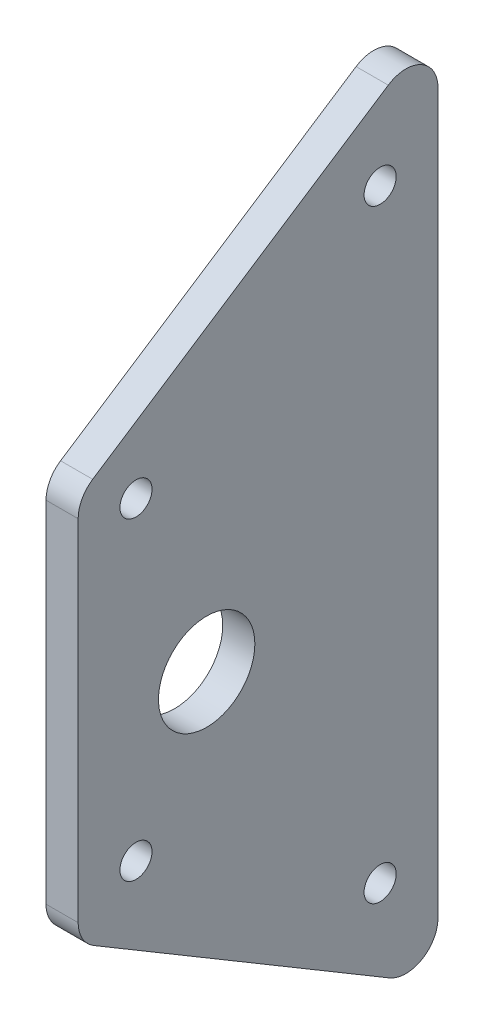
ISO-10303-21;
HEADER;
FILE_DESCRIPTION(('STEP AP214'),'2;1');
FILE_NAME('part.step','',(''),(''),'','','');
FILE_SCHEMA(('AUTOMOTIVE_DESIGN { 1 0 10303 214 1 1 1 1 }'));
ENDSEC;
DATA;
#1=APPLICATION_CONTEXT('core data for automotive mechanical design processes');
#2=APPLICATION_PROTOCOL_DEFINITION('international standard','automotive_design',2000,#1);
#3=PRODUCT_CONTEXT('',#1,'mechanical');
#4=PRODUCT('Part','Part','',(#3));
#5=PRODUCT_RELATED_PRODUCT_CATEGORY('part','',(#4));
#6=PRODUCT_DEFINITION_FORMATION('','',#4);
#7=PRODUCT_DEFINITION_CONTEXT('part definition',#1,'design');
#8=PRODUCT_DEFINITION('design','',#6,#7);
#9=PRODUCT_DEFINITION_SHAPE('','',#8);
#10=(LENGTH_UNIT() NAMED_UNIT(*) SI_UNIT(.MILLI.,.METRE.));
#11=(NAMED_UNIT(*) PLANE_ANGLE_UNIT() SI_UNIT($,.RADIAN.));
#12=(NAMED_UNIT(*) SI_UNIT($,.STERADIAN.) SOLID_ANGLE_UNIT());
#13=UNCERTAINTY_MEASURE_WITH_UNIT(LENGTH_MEASURE(1.E-05),#10,'distance_accuracy_value','');
#14=(GEOMETRIC_REPRESENTATION_CONTEXT(3) GLOBAL_UNCERTAINTY_ASSIGNED_CONTEXT((#13)) GLOBAL_UNIT_ASSIGNED_CONTEXT((#10,
#11,#12)) REPRESENTATION_CONTEXT('',''));
#15=CARTESIAN_POINT('',(0.,0.,0.));
#16=DIRECTION('',(0.,0.,1.));
#17=DIRECTION('',(1.,0.,0.));
#18=AXIS2_PLACEMENT_3D('',#15,#16,#17);
#19=CARTESIAN_POINT('',(6.35,54.7306145251397,-7.04530726256982));
#20=DIRECTION('',(-1.,0.,0.));
#21=DIRECTION('',(0.,0.,1.));
#22=AXIS2_PLACEMENT_3D('',#19,#20,#21);
#23=CYLINDRICAL_SURFACE('',#22,3.175);
#24=CARTESIAN_POINT('',(6.35,54.7306145251397,-7.04530726256982));
#25=DIRECTION('',(1.,0.,0.));
#26=DIRECTION('',(0.,0.,-1.));
#27=AXIS2_PLACEMENT_3D('',#24,#25,#26);
#28=CIRCLE('',#27,3.175);
#29=CARTESIAN_POINT('',(6.35,54.7306145251397,-10.2203072625698));
#30=VERTEX_POINT('',#29);
#31=EDGE_CURVE('E142',#30,#30,#28,.T.);
#32=ORIENTED_EDGE('',*,*,#31,.T.);
#33=EDGE_LOOP('',(#32));
#34=FACE_BOUND('',#33,.T.);
#35=CARTESIAN_POINT('',(1.27,54.7306145251397,-7.04530726256982));
#36=DIRECTION('',(-1.,0.,0.));
#37=DIRECTION('',(0.,0.,1.));
#38=AXIS2_PLACEMENT_3D('',#35,#36,#37);
#39=CIRCLE('',#38,3.175);
#40=CARTESIAN_POINT('',(1.27,54.7306145251397,-3.87030726256982));
#41=VERTEX_POINT('',#40);
#42=EDGE_CURVE('E424',#41,#41,#39,.T.);
#43=ORIENTED_EDGE('',*,*,#42,.T.);
#44=EDGE_LOOP('',(#43));
#45=FACE_BOUND('',#44,.T.);
#46=ADVANCED_FACE('F41',(#34,#45),#23,.F.);
#47=CARTESIAN_POINT('',(6.35,25.3333471472673,41.2146927374302));
#48=DIRECTION('',(-1.,0.,0.));
#49=DIRECTION('',(0.,0.,1.));
#50=AXIS2_PLACEMENT_3D('',#47,#48,#49);
#51=CYLINDRICAL_SURFACE('',#50,3.175);
#52=CARTESIAN_POINT('',(6.35,25.3333471472673,41.2146927374302));
#53=DIRECTION('',(1.,0.,0.));
#54=DIRECTION('',(0.,0.,-1.));
#55=AXIS2_PLACEMENT_3D('',#52,#53,#54);
#56=CIRCLE('',#55,3.175);
#57=CARTESIAN_POINT('',(6.35,25.3333471472673,38.0396927374302));
#58=VERTEX_POINT('',#57);
#59=EDGE_CURVE('E191',#58,#58,#56,.T.);
#60=ORIENTED_EDGE('',*,*,#59,.T.);
#61=EDGE_LOOP('',(#60));
#62=FACE_BOUND('',#61,.T.);
#63=CARTESIAN_POINT('',(1.27,25.3333471472673,41.2146927374302));
#64=DIRECTION('',(-1.,0.,0.));
#65=DIRECTION('',(0.,0.,1.));
#66=AXIS2_PLACEMENT_3D('',#63,#64,#65);
#67=CIRCLE('',#66,3.175);
#68=CARTESIAN_POINT('',(1.27,25.3333471472673,44.3896927374302));
#69=VERTEX_POINT('',#68);
#70=EDGE_CURVE('E44',#69,#69,#67,.T.);
#71=ORIENTED_EDGE('',*,*,#70,.T.);
#72=EDGE_LOOP('',(#71));
#73=FACE_BOUND('',#72,.T.);
#74=ADVANCED_FACE('F234',(#62,#73),#51,.F.);
#75=CARTESIAN_POINT('',(6.35,-64.6493854748604,-7.04530726256982));
#76=DIRECTION('',(-1.,0.,0.));
#77=DIRECTION('',(0.,0.,1.));
#78=AXIS2_PLACEMENT_3D('',#75,#76,#77);
#79=CYLINDRICAL_SURFACE('',#78,3.175);
#80=CARTESIAN_POINT('',(6.35,-64.6493854748604,-7.04530726256982));
#81=DIRECTION('',(1.,0.,0.));
#82=DIRECTION('',(0.,0.,-1.));
#83=AXIS2_PLACEMENT_3D('',#80,#81,#82);
#84=CIRCLE('',#83,3.175);
#85=CARTESIAN_POINT('',(6.35,-64.6493854748604,-10.2203072625698));
#86=VERTEX_POINT('',#85);
#87=EDGE_CURVE('E195',#86,#86,#84,.T.);
#88=ORIENTED_EDGE('',*,*,#87,.T.);
#89=EDGE_LOOP('',(#88));
#90=FACE_BOUND('',#89,.T.);
#91=CARTESIAN_POINT('',(1.27,-64.6493854748604,-7.04530726256982));
#92=DIRECTION('',(-1.,0.,0.));
#93=DIRECTION('',(0.,0.,1.));
#94=AXIS2_PLACEMENT_3D('',#91,#92,#93);
#95=CIRCLE('',#94,3.175);
#96=CARTESIAN_POINT('',(1.27,-64.6493854748604,-3.87030726256982));
#97=VERTEX_POINT('',#96);
#98=EDGE_CURVE('E175',#97,#97,#95,.T.);
#99=ORIENTED_EDGE('',*,*,#98,.T.);
#100=EDGE_LOOP('',(#99));
#101=FACE_BOUND('',#100,.T.);
#102=ADVANCED_FACE('F243',(#90,#101),#79,.F.);
#103=CARTESIAN_POINT('',(6.35,-36.7093854748603,41.2146927374302));
#104=DIRECTION('',(-1.,0.,0.));
#105=DIRECTION('',(0.,0.,1.));
#106=AXIS2_PLACEMENT_3D('',#103,#104,#105);
#107=CYLINDRICAL_SURFACE('',#106,3.175);
#108=CARTESIAN_POINT('',(6.35,-36.7093854748603,41.2146927374302));
#109=DIRECTION('',(1.,0.,0.));
#110=DIRECTION('',(0.,0.,-1.));
#111=AXIS2_PLACEMENT_3D('',#108,#109,#110);
#112=CIRCLE('',#111,3.175);
#113=CARTESIAN_POINT('',(6.35,-36.7093854748603,38.0396927374302));
#114=VERTEX_POINT('',#113);
#115=EDGE_CURVE('E188',#114,#114,#112,.T.);
#116=ORIENTED_EDGE('',*,*,#115,.T.);
#117=EDGE_LOOP('',(#116));
#118=FACE_BOUND('',#117,.T.);
#119=CARTESIAN_POINT('',(1.27,-36.7093854748603,41.2146927374302));
#120=DIRECTION('',(-1.,0.,0.));
#121=DIRECTION('',(0.,0.,1.));
#122=AXIS2_PLACEMENT_3D('',#119,#120,#121);
#123=CIRCLE('',#122,3.175);
#124=CARTESIAN_POINT('',(1.27,-36.7093854748603,44.3896927374302));
#125=VERTEX_POINT('',#124);
#126=EDGE_CURVE('E168',#125,#125,#123,.T.);
#127=ORIENTED_EDGE('',*,*,#126,.T.);
#128=EDGE_LOOP('',(#127));
#129=FACE_BOUND('',#128,.T.);
#130=ADVANCED_FACE('F249',(#118,#129),#107,.F.);
#131=CARTESIAN_POINT('',(6.35,0.,0.));
#132=DIRECTION('',(1.,0.,0.));
#133=DIRECTION('',(0.,0.,-1.));
#134=AXIS2_PLACEMENT_3D('',#131,#132,#133);
#135=PLANE('',#134);
#136=ORIENTED_EDGE('',*,*,#115,.F.);
#137=EDGE_LOOP('',(#136));
#138=FACE_BOUND('',#137,.T.);
#139=ORIENTED_EDGE('',*,*,#59,.F.);
#140=EDGE_LOOP('',(#139));
#141=FACE_BOUND('',#140,.T.);
#142=DIRECTION('',(0.,-0.54794169230733,0.836516528128034));
#143=VECTOR('',#142,1.);
#144=CARTESIAN_POINT('',(6.35,77.5906145251397,-18.4753072625698));
#145=LINE('',#144,#143);
#146=CARTESIAN_POINT('',(6.35,71.1520634763337,-8.64587751641827));
#147=VERTEX_POINT('',#146);
#148=CARTESIAN_POINT('',(6.35,32.8853316327583,49.7741224835817));
#149=VERTEX_POINT('',#148);
#150=EDGE_CURVE('E150',#147,#149,#145,.T.);
#151=ORIENTED_EDGE('',*,*,#150,.T.);
#152=CARTESIAN_POINT('',(6.35,27.5734516791453,46.2946927374302));
#153=DIRECTION('',(1.,0.,0.));
#154=DIRECTION('',(0.,0.,-1.));
#155=AXIS2_PLACEMENT_3D('',#152,#153,#154);
#156=CIRCLE('',#155,6.35);
#157=CARTESIAN_POINT('',(6.35,27.5734516791453,52.6446927374302));
#158=VERTEX_POINT('',#157);
#159=EDGE_CURVE('E165',#149,#158,#156,.T.);
#160=ORIENTED_EDGE('',*,*,#159,.T.);
#161=DIRECTION('',(0.,-1.,0.));
#162=VECTOR('',#161,1.);
#163=CARTESIAN_POINT('',(6.35,31.0050279329609,52.6446927374302));
#164=LINE('',#163,#162);
#165=CARTESIAN_POINT('',(6.35,-41.5841115650761,52.6446927374302));
#166=VERTEX_POINT('',#165);
#167=EDGE_CURVE('E129',#158,#166,#164,.T.);
#168=ORIENTED_EDGE('',*,*,#167,.T.);
#169=CARTESIAN_POINT('',(6.35,-41.5841115650761,46.2946927374302));
#170=DIRECTION('',(1.,0.,0.));
#171=DIRECTION('',(0.,0.,-1.));
#172=AXIS2_PLACEMENT_3D('',#169,#170,#171);
#173=CIRCLE('',#172,6.35);
#174=CARTESIAN_POINT('',(6.35,-47.0412593431563,49.5415432310924));
#175=VERTEX_POINT('',#174);
#176=EDGE_CURVE('E159',#166,#175,#173,.T.);
#177=ORIENTED_EDGE('',*,*,#176,.T.);
#178=DIRECTION('',(0.,-0.511315038372004,-0.859393350878767));
#179=VECTOR('',#178,1.);
#180=CARTESIAN_POINT('',(6.35,-45.1949720670391,52.6446927374302));
#181=LINE('',#180,#179);
#182=CARTESIAN_POINT('',(6.35,-81.7995274995809,-8.87845676890757));
#183=VERTEX_POINT('',#182);
#184=EDGE_CURVE('E201',#175,#183,#181,.T.);
#185=ORIENTED_EDGE('',*,*,#184,.T.);
#186=CARTESIAN_POINT('',(6.35,-76.3423797215007,-12.1253072625698));
#187=DIRECTION('',(1.,0.,0.));
#188=DIRECTION('',(0.,0.,-1.));
#189=AXIS2_PLACEMENT_3D('',#186,#187,#188);
#190=CIRCLE('',#189,6.35);
#191=CARTESIAN_POINT('',(6.35,-76.3423797215007,-18.4753072625698));
#192=VERTEX_POINT('',#191);
#193=EDGE_CURVE('E64',#183,#192,#190,.T.);
#194=ORIENTED_EDGE('',*,*,#193,.T.);
#195=DIRECTION('',(0.,1.,0.));
#196=VECTOR('',#195,1.);
#197=CARTESIAN_POINT('',(6.35,-87.5093854748603,-18.4753072625698));
#198=LINE('',#197,#196);
#199=CARTESIAN_POINT('',(6.35,65.8401835227207,-18.4753072625698));
#200=VERTEX_POINT('',#199);
#201=EDGE_CURVE('E146',#192,#200,#198,.T.);
#202=ORIENTED_EDGE('',*,*,#201,.T.);
#203=CARTESIAN_POINT('',(6.35,65.8401835227207,-12.1253072625698));
#204=DIRECTION('',(1.,0.,0.));
#205=DIRECTION('',(0.,0.,-1.));
#206=AXIS2_PLACEMENT_3D('',#203,#204,#205);
#207=CIRCLE('',#206,6.35);
#208=EDGE_CURVE('E160',#200,#147,#207,.T.);
#209=ORIENTED_EDGE('',*,*,#208,.T.);
#210=EDGE_LOOP('',(#151,#160,#168,#177,#185,#194,#202,#209));
#211=FACE_BOUND('',#210,.T.);
#212=ORIENTED_EDGE('',*,*,#31,.F.);
#213=EDGE_LOOP('',(#212));
#214=FACE_BOUND('',#213,.T.);
#215=ORIENTED_EDGE('',*,*,#87,.F.);
#216=EDGE_LOOP('',(#215));
#217=FACE_BOUND('',#216,.T.);
#218=CARTESIAN_POINT('',(6.35,-11.3093854748603,27.2446927374302));
#219=DIRECTION('',(1.,0.,0.));
#220=DIRECTION('',(0.,0.,-1.));
#221=AXIS2_PLACEMENT_3D('',#218,#219,#220);
#222=CIRCLE('',#221,9.525);
#223=CARTESIAN_POINT('',(6.35,-11.3093854748603,17.7196927374302));
#224=VERTEX_POINT('',#223);
#225=EDGE_CURVE('E185',#224,#224,#222,.T.);
#226=ORIENTED_EDGE('',*,*,#225,.F.);
#227=EDGE_LOOP('',(#226));
#228=FACE_BOUND('',#227,.T.);
#229=ADVANCED_FACE('F202',(#138,#141,#211,#214,#217,#228),#135,.T.);
#230=CARTESIAN_POINT('',(0.,0.,0.));
#231=DIRECTION('',(1.,0.,0.));
#232=DIRECTION('',(0.,0.,-1.));
#233=AXIS2_PLACEMENT_3D('',#230,#231,#232);
#234=PLANE('',#233);
#235=CARTESIAN_POINT('',(0.,54.7306145251397,-7.04530726256982));
#236=DIRECTION('',(-1.,0.,0.));
#237=DIRECTION('',(0.,0.,1.));
#238=AXIS2_PLACEMENT_3D('',#235,#236,#237);
#239=CIRCLE('',#238,6.35);
#240=CARTESIAN_POINT('',(0.,54.7306145251397,-0.695307262569817));
#241=VERTEX_POINT('',#240);
#242=EDGE_CURVE('E430',#241,#241,#239,.T.);
#243=ORIENTED_EDGE('',*,*,#242,.F.);
#244=EDGE_LOOP('',(#243));
#245=FACE_BOUND('',#244,.T.);
#246=CARTESIAN_POINT('',(0.,25.3333471472673,41.2146927374302));
#247=DIRECTION('',(-1.,0.,0.));
#248=DIRECTION('',(0.,0.,1.));
#249=AXIS2_PLACEMENT_3D('',#246,#247,#248);
#250=CIRCLE('',#249,6.35);
#251=CARTESIAN_POINT('',(0.,25.3333471472673,47.5646927374302));
#252=VERTEX_POINT('',#251);
#253=EDGE_CURVE('E433',#252,#252,#250,.T.);
#254=ORIENTED_EDGE('',*,*,#253,.F.);
#255=EDGE_LOOP('',(#254));
#256=FACE_BOUND('',#255,.T.);
#257=CARTESIAN_POINT('',(0.,-36.7093854748603,41.2146927374302));
#258=DIRECTION('',(-1.,0.,0.));
#259=DIRECTION('',(0.,0.,1.));
#260=AXIS2_PLACEMENT_3D('',#257,#258,#259);
#261=CIRCLE('',#260,6.35);
#262=CARTESIAN_POINT('',(0.,-36.7093854748603,47.5646927374302));
#263=VERTEX_POINT('',#262);
#264=EDGE_CURVE('E438',#263,#263,#261,.T.);
#265=ORIENTED_EDGE('',*,*,#264,.F.);
#266=EDGE_LOOP('',(#265));
#267=FACE_BOUND('',#266,.T.);
#268=CARTESIAN_POINT('',(0.,-64.6493854748604,-7.04530726256982));
#269=DIRECTION('',(-1.,0.,0.));
#270=DIRECTION('',(0.,0.,1.));
#271=AXIS2_PLACEMENT_3D('',#268,#269,#270);
#272=CIRCLE('',#271,6.35);
#273=CARTESIAN_POINT('',(0.,-64.6493854748604,-0.69530726256982));
#274=VERTEX_POINT('',#273);
#275=EDGE_CURVE('E443',#274,#274,#272,.T.);
#276=ORIENTED_EDGE('',*,*,#275,.F.);
#277=EDGE_LOOP('',(#276));
#278=FACE_BOUND('',#277,.T.);
#279=DIRECTION('',(0.,-1.,0.));
#280=VECTOR('',#279,1.);
#281=CARTESIAN_POINT('',(0.,31.0050279329609,52.6446927374302));
#282=LINE('',#281,#280);
#283=CARTESIAN_POINT('',(0.,27.5734516791453,52.6446927374302));
#284=VERTEX_POINT('',#283);
#285=CARTESIAN_POINT('',(0.,-41.5841115650761,52.6446927374302));
#286=VERTEX_POINT('',#285);
#287=EDGE_CURVE('E127',#284,#286,#282,.T.);
#288=ORIENTED_EDGE('',*,*,#287,.F.);
#289=CARTESIAN_POINT('',(0.,27.5734516791453,46.2946927374302));
#290=DIRECTION('',(1.,0.,0.));
#291=DIRECTION('',(0.,0.,-1.));
#292=AXIS2_PLACEMENT_3D('',#289,#290,#291);
#293=CIRCLE('',#292,6.35);
#294=CARTESIAN_POINT('',(0.,32.8853316327583,49.7741224835817));
#295=VERTEX_POINT('',#294);
#296=EDGE_CURVE('E108',#284,#295,#293,.F.);
#297=ORIENTED_EDGE('',*,*,#296,.T.);
#298=DIRECTION('',(0.,-0.54794169230733,0.836516528128034));
#299=VECTOR('',#298,1.);
#300=CARTESIAN_POINT('',(0.,77.5906145251397,-18.4753072625698));
#301=LINE('',#300,#299);
#302=CARTESIAN_POINT('',(0.,71.1520634763337,-8.64587751641827));
#303=VERTEX_POINT('',#302);
#304=EDGE_CURVE('E140',#303,#295,#301,.T.);
#305=ORIENTED_EDGE('',*,*,#304,.F.);
#306=CARTESIAN_POINT('',(0.,65.8401835227207,-12.1253072625698));
#307=DIRECTION('',(1.,0.,0.));
#308=DIRECTION('',(0.,0.,-1.));
#309=AXIS2_PLACEMENT_3D('',#306,#307,#308);
#310=CIRCLE('',#309,6.35);
#311=CARTESIAN_POINT('',(0.,65.8401835227207,-18.4753072625698));
#312=VERTEX_POINT('',#311);
#313=EDGE_CURVE('E128',#303,#312,#310,.F.);
#314=ORIENTED_EDGE('',*,*,#313,.T.);
#315=DIRECTION('',(0.,1.,0.));
#316=VECTOR('',#315,1.);
#317=CARTESIAN_POINT('',(0.,-87.5093854748603,-18.4753072625698));
#318=LINE('',#317,#316);
#319=CARTESIAN_POINT('',(0.,-76.3423797215007,-18.4753072625698));
#320=VERTEX_POINT('',#319);
#321=EDGE_CURVE('E136',#320,#312,#318,.T.);
#322=ORIENTED_EDGE('',*,*,#321,.F.);
#323=CARTESIAN_POINT('',(0.,-76.3423797215007,-12.1253072625698));
#324=DIRECTION('',(1.,0.,0.));
#325=DIRECTION('',(0.,0.,-1.));
#326=AXIS2_PLACEMENT_3D('',#323,#324,#325);
#327=CIRCLE('',#326,6.35);
#328=CARTESIAN_POINT('',(0.,-81.7995274995809,-8.87845676890757));
#329=VERTEX_POINT('',#328);
#330=EDGE_CURVE('E151',#320,#329,#327,.F.);
#331=ORIENTED_EDGE('',*,*,#330,.T.);
#332=DIRECTION('',(0.,-0.511315038372004,-0.859393350878767));
#333=VECTOR('',#332,1.);
#334=CARTESIAN_POINT('',(0.,-45.1949720670391,52.6446927374302));
#335=LINE('',#334,#333);
#336=CARTESIAN_POINT('',(0.,-47.0412593431563,49.5415432310924));
#337=VERTEX_POINT('',#336);
#338=EDGE_CURVE('E137',#337,#329,#335,.T.);
#339=ORIENTED_EDGE('',*,*,#338,.F.);
#340=CARTESIAN_POINT('',(0.,-41.5841115650761,46.2946927374302));
#341=DIRECTION('',(1.,0.,0.));
#342=DIRECTION('',(0.,0.,-1.));
#343=AXIS2_PLACEMENT_3D('',#340,#341,#342);
#344=CIRCLE('',#343,6.35);
#345=EDGE_CURVE('E117',#337,#286,#344,.F.);
#346=ORIENTED_EDGE('',*,*,#345,.T.);
#347=EDGE_LOOP('',(#288,#297,#305,#314,#322,#331,#339,#346));
#348=FACE_BOUND('',#347,.T.);
#349=CARTESIAN_POINT('',(0.,-11.3093854748603,27.2446927374302));
#350=DIRECTION('',(1.,0.,0.));
#351=DIRECTION('',(0.,0.,-1.));
#352=AXIS2_PLACEMENT_3D('',#349,#350,#351);
#353=CIRCLE('',#352,9.525);
#354=CARTESIAN_POINT('',(0.,-11.3093854748603,17.7196927374302));
#355=VERTEX_POINT('',#354);
#356=EDGE_CURVE('E178',#355,#355,#353,.T.);
#357=ORIENTED_EDGE('',*,*,#356,.T.);
#358=EDGE_LOOP('',(#357));
#359=FACE_BOUND('',#358,.T.);
#360=ADVANCED_FACE('F131',(#245,#256,#267,#278,#348,#359),#234,.F.);
#361=CARTESIAN_POINT('',(6.35,77.5906145251397,-18.4753072625698));
#362=DIRECTION('',(0.,-0.836516528128034,-0.54794169230733));
#363=DIRECTION('',(0.,0.54794169230733,-0.836516528128034));
#364=AXIS2_PLACEMENT_3D('',#361,#362,#363);
#365=PLANE('',#364);
#366=ORIENTED_EDGE('',*,*,#304,.T.);
#367=DIRECTION('',(-1.,0.,0.));
#368=VECTOR('',#367,1.);
#369=CARTESIAN_POINT('',(6.35,32.8853316327583,49.7741224835817));
#370=LINE('',#369,#368);
#371=EDGE_CURVE('E111',#295,#149,#370,.F.);
#372=ORIENTED_EDGE('',*,*,#371,.T.);
#373=ORIENTED_EDGE('',*,*,#150,.F.);
#374=DIRECTION('',(-1.,0.,0.));
#375=VECTOR('',#374,1.);
#376=CARTESIAN_POINT('',(6.35,71.1520634763337,-8.64587751641827));
#377=LINE('',#376,#375);
#378=EDGE_CURVE('E119',#147,#303,#377,.T.);
#379=ORIENTED_EDGE('',*,*,#378,.T.);
#380=EDGE_LOOP('',(#366,#372,#373,#379));
#381=FACE_BOUND('',#380,.T.);
#382=ADVANCED_FACE('F215',(#381),#365,.F.);
#383=CARTESIAN_POINT('',(6.35,31.0050279329609,52.6446927374302));
#384=DIRECTION('',(0.,0.,-1.));
#385=DIRECTION('',(0.,1.,0.));
#386=AXIS2_PLACEMENT_3D('',#383,#384,#385);
#387=PLANE('',#386);
#388=ORIENTED_EDGE('',*,*,#167,.F.);
#389=DIRECTION('',(-1.,0.,0.));
#390=VECTOR('',#389,1.);
#391=CARTESIAN_POINT('',(6.35,27.5734516791453,52.6446927374302));
#392=LINE('',#391,#390);
#393=EDGE_CURVE('E114',#158,#284,#392,.T.);
#394=ORIENTED_EDGE('',*,*,#393,.T.);
#395=ORIENTED_EDGE('',*,*,#287,.T.);
#396=DIRECTION('',(-1.,0.,0.));
#397=VECTOR('',#396,1.);
#398=CARTESIAN_POINT('',(6.35,-41.5841115650761,52.6446927374302));
#399=LINE('',#398,#397);
#400=EDGE_CURVE('E133',#286,#166,#399,.F.);
#401=ORIENTED_EDGE('',*,*,#400,.T.);
#402=EDGE_LOOP('',(#388,#394,#395,#401));
#403=FACE_BOUND('',#402,.T.);
#404=ADVANCED_FACE('F121',(#403),#387,.F.);
#405=CARTESIAN_POINT('',(6.35,-45.1949720670391,52.6446927374302));
#406=DIRECTION('',(0.,0.859393350878767,-0.511315038372004));
#407=DIRECTION('',(0.,0.511315038372004,0.859393350878767));
#408=AXIS2_PLACEMENT_3D('',#405,#406,#407);
#409=PLANE('',#408);
#410=ORIENTED_EDGE('',*,*,#184,.F.);
#411=DIRECTION('',(-1.,0.,0.));
#412=VECTOR('',#411,1.);
#413=CARTESIAN_POINT('',(6.35,-47.0412593431563,49.5415432310924));
#414=LINE('',#413,#412);
#415=EDGE_CURVE('E167',#175,#337,#414,.T.);
#416=ORIENTED_EDGE('',*,*,#415,.T.);
#417=ORIENTED_EDGE('',*,*,#338,.T.);
#418=DIRECTION('',(-1.,0.,0.));
#419=VECTOR('',#418,1.);
#420=CARTESIAN_POINT('',(6.35,-81.7995274995809,-8.87845676890757));
#421=LINE('',#420,#419);
#422=EDGE_CURVE('E163',#329,#183,#421,.F.);
#423=ORIENTED_EDGE('',*,*,#422,.T.);
#424=EDGE_LOOP('',(#410,#416,#417,#423));
#425=FACE_BOUND('',#424,.T.);
#426=ADVANCED_FACE('F219',(#425),#409,.F.);
#427=CARTESIAN_POINT('',(6.35,-87.5093854748603,-18.4753072625698));
#428=DIRECTION('',(0.,0.,1.));
#429=DIRECTION('',(0.,-1.,0.));
#430=AXIS2_PLACEMENT_3D('',#427,#428,#429);
#431=PLANE('',#430);
#432=ORIENTED_EDGE('',*,*,#201,.F.);
#433=DIRECTION('',(-1.,0.,0.));
#434=VECTOR('',#433,1.);
#435=CARTESIAN_POINT('',(6.35,-76.3423797215007,-18.4753072625698));
#436=LINE('',#435,#434);
#437=EDGE_CURVE('E11',#192,#320,#436,.T.);
#438=ORIENTED_EDGE('',*,*,#437,.T.);
#439=ORIENTED_EDGE('',*,*,#321,.T.);
#440=DIRECTION('',(-1.,0.,0.));
#441=VECTOR('',#440,1.);
#442=CARTESIAN_POINT('',(6.35,65.8401835227207,-18.4753072625698));
#443=LINE('',#442,#441);
#444=EDGE_CURVE('E49',#312,#200,#443,.F.);
#445=ORIENTED_EDGE('',*,*,#444,.T.);
#446=EDGE_LOOP('',(#432,#438,#439,#445));
#447=FACE_BOUND('',#446,.T.);
#448=ADVANCED_FACE('F212',(#447),#431,.F.);
#449=CARTESIAN_POINT('',(6.35,-11.3093854748603,27.2446927374302));
#450=DIRECTION('',(-1.,0.,0.));
#451=DIRECTION('',(0.,0.,1.));
#452=AXIS2_PLACEMENT_3D('',#449,#450,#451);
#453=CYLINDRICAL_SURFACE('',#452,9.525);
#454=ORIENTED_EDGE('',*,*,#225,.T.);
#455=EDGE_LOOP('',(#454));
#456=FACE_BOUND('',#455,.T.);
#457=ORIENTED_EDGE('',*,*,#356,.F.);
#458=EDGE_LOOP('',(#457));
#459=FACE_BOUND('',#458,.T.);
#460=ADVANCED_FACE('F232',(#456,#459),#453,.F.);
#461=CARTESIAN_POINT('',(6.35,27.5734516791453,46.2946927374302));
#462=DIRECTION('',(-1.,0.,0.));
#463=DIRECTION('',(0.,0.,1.));
#464=AXIS2_PLACEMENT_3D('',#461,#462,#463);
#465=CYLINDRICAL_SURFACE('',#464,6.35);
#466=ORIENTED_EDGE('',*,*,#159,.F.);
#467=ORIENTED_EDGE('',*,*,#371,.F.);
#468=ORIENTED_EDGE('',*,*,#296,.F.);
#469=ORIENTED_EDGE('',*,*,#393,.F.);
#470=EDGE_LOOP('',(#466,#467,#468,#469));
#471=FACE_BOUND('',#470,.T.);
#472=ADVANCED_FACE('F115',(#471),#465,.T.);
#473=CARTESIAN_POINT('',(6.35,-41.5841115650761,46.2946927374302));
#474=DIRECTION('',(-1.,0.,0.));
#475=DIRECTION('',(0.,0.,1.));
#476=AXIS2_PLACEMENT_3D('',#473,#474,#475);
#477=CYLINDRICAL_SURFACE('',#476,6.35);
#478=ORIENTED_EDGE('',*,*,#176,.F.);
#479=ORIENTED_EDGE('',*,*,#400,.F.);
#480=ORIENTED_EDGE('',*,*,#345,.F.);
#481=ORIENTED_EDGE('',*,*,#415,.F.);
#482=EDGE_LOOP('',(#478,#479,#480,#481));
#483=FACE_BOUND('',#482,.T.);
#484=ADVANCED_FACE('F221',(#483),#477,.T.);
#485=CARTESIAN_POINT('',(6.35,-76.3423797215007,-12.1253072625698));
#486=DIRECTION('',(-1.,0.,0.));
#487=DIRECTION('',(0.,0.,1.));
#488=AXIS2_PLACEMENT_3D('',#485,#486,#487);
#489=CYLINDRICAL_SURFACE('',#488,6.35);
#490=ORIENTED_EDGE('',*,*,#193,.F.);
#491=ORIENTED_EDGE('',*,*,#422,.F.);
#492=ORIENTED_EDGE('',*,*,#330,.F.);
#493=ORIENTED_EDGE('',*,*,#437,.F.);
#494=EDGE_LOOP('',(#490,#491,#492,#493));
#495=FACE_BOUND('',#494,.T.);
#496=ADVANCED_FACE('F216',(#495),#489,.T.);
#497=CARTESIAN_POINT('',(6.35,65.8401835227207,-12.1253072625698));
#498=DIRECTION('',(-1.,0.,0.));
#499=DIRECTION('',(0.,0.,1.));
#500=AXIS2_PLACEMENT_3D('',#497,#498,#499);
#501=CYLINDRICAL_SURFACE('',#500,6.35);
#502=ORIENTED_EDGE('',*,*,#208,.F.);
#503=ORIENTED_EDGE('',*,*,#444,.F.);
#504=ORIENTED_EDGE('',*,*,#313,.F.);
#505=ORIENTED_EDGE('',*,*,#378,.F.);
#506=EDGE_LOOP('',(#502,#503,#504,#505));
#507=FACE_BOUND('',#506,.T.);
#508=ADVANCED_FACE('F43',(#507),#501,.T.);
#509=CARTESIAN_POINT('',(1.27,-36.7093854748603,41.2146927374302));
#510=DIRECTION('',(-1.,0.,0.));
#511=DIRECTION('',(0.,0.,1.));
#512=AXIS2_PLACEMENT_3D('',#509,#510,#511);
#513=CYLINDRICAL_SURFACE('',#512,6.35);
#514=CARTESIAN_POINT('',(1.27,-36.7093854748603,41.2146927374302));
#515=DIRECTION('',(-1.,0.,0.));
#516=DIRECTION('',(0.,0.,1.));
#517=AXIS2_PLACEMENT_3D('',#514,#515,#516);
#518=CIRCLE('',#517,6.35);
#519=CARTESIAN_POINT('',(1.27,-36.7093854748603,47.5646927374302));
#520=VERTEX_POINT('',#519);
#521=EDGE_CURVE('E445',#520,#520,#518,.T.);
#522=ORIENTED_EDGE('',*,*,#521,.F.);
#523=EDGE_LOOP('',(#522));
#524=FACE_BOUND('',#523,.T.);
#525=ORIENTED_EDGE('',*,*,#264,.T.);
#526=EDGE_LOOP('',(#525));
#527=FACE_BOUND('',#526,.T.);
#528=ADVANCED_FACE('F309',(#524,#527),#513,.F.);
#529=CARTESIAN_POINT('',(1.27,-36.7093854748603,41.2146927374302));
#530=DIRECTION('',(-1.,0.,0.));
#531=DIRECTION('',(0.,0.,1.));
#532=AXIS2_PLACEMENT_3D('',#529,#530,#531);
#533=PLANE('',#532);
#534=ORIENTED_EDGE('',*,*,#126,.F.);
#535=EDGE_LOOP('',(#534));
#536=FACE_BOUND('',#535,.T.);
#537=ORIENTED_EDGE('',*,*,#521,.T.);
#538=EDGE_LOOP('',(#537));
#539=FACE_BOUND('',#538,.T.);
#540=ADVANCED_FACE('F345',(#536,#539),#533,.T.);
#541=CARTESIAN_POINT('',(1.27,-64.6493854748604,-7.04530726256982));
#542=DIRECTION('',(-1.,0.,0.));
#543=DIRECTION('',(0.,0.,1.));
#544=AXIS2_PLACEMENT_3D('',#541,#542,#543);
#545=CYLINDRICAL_SURFACE('',#544,6.35);
#546=CARTESIAN_POINT('',(1.27,-64.6493854748604,-7.04530726256982));
#547=DIRECTION('',(-1.,0.,0.));
#548=DIRECTION('',(0.,0.,1.));
#549=AXIS2_PLACEMENT_3D('',#546,#547,#548);
#550=CIRCLE('',#549,6.35);
#551=CARTESIAN_POINT('',(1.27,-64.6493854748604,-0.69530726256982));
#552=VERTEX_POINT('',#551);
#553=EDGE_CURVE('E450',#552,#552,#550,.T.);
#554=ORIENTED_EDGE('',*,*,#553,.F.);
#555=EDGE_LOOP('',(#554));
#556=FACE_BOUND('',#555,.T.);
#557=ORIENTED_EDGE('',*,*,#275,.T.);
#558=EDGE_LOOP('',(#557));
#559=FACE_BOUND('',#558,.T.);
#560=ADVANCED_FACE('F355',(#556,#559),#545,.F.);
#561=CARTESIAN_POINT('',(1.27,-64.6493854748604,-7.04530726256982));
#562=DIRECTION('',(-1.,0.,0.));
#563=DIRECTION('',(0.,0.,1.));
#564=AXIS2_PLACEMENT_3D('',#561,#562,#563);
#565=PLANE('',#564);
#566=ORIENTED_EDGE('',*,*,#98,.F.);
#567=EDGE_LOOP('',(#566));
#568=FACE_BOUND('',#567,.T.);
#569=ORIENTED_EDGE('',*,*,#553,.T.);
#570=EDGE_LOOP('',(#569));
#571=FACE_BOUND('',#570,.T.);
#572=ADVANCED_FACE('F362',(#568,#571),#565,.T.);
#573=CARTESIAN_POINT('',(1.27,25.3333471472673,41.2146927374302));
#574=DIRECTION('',(-1.,0.,0.));
#575=DIRECTION('',(0.,0.,1.));
#576=AXIS2_PLACEMENT_3D('',#573,#574,#575);
#577=CYLINDRICAL_SURFACE('',#576,6.35);
#578=CARTESIAN_POINT('',(1.27,25.3333471472673,41.2146927374302));
#579=DIRECTION('',(-1.,0.,0.));
#580=DIRECTION('',(0.,0.,1.));
#581=AXIS2_PLACEMENT_3D('',#578,#579,#580);
#582=CIRCLE('',#581,6.35);
#583=CARTESIAN_POINT('',(1.27,25.3333471472673,47.5646927374302));
#584=VERTEX_POINT('',#583);
#585=EDGE_CURVE('E436',#584,#584,#582,.T.);
#586=ORIENTED_EDGE('',*,*,#585,.F.);
#587=EDGE_LOOP('',(#586));
#588=FACE_BOUND('',#587,.T.);
#589=ORIENTED_EDGE('',*,*,#253,.T.);
#590=EDGE_LOOP('',(#589));
#591=FACE_BOUND('',#590,.T.);
#592=ADVANCED_FACE('F375',(#588,#591),#577,.F.);
#593=CARTESIAN_POINT('',(1.27,25.3333471472673,41.2146927374302));
#594=DIRECTION('',(-1.,0.,0.));
#595=DIRECTION('',(0.,0.,1.));
#596=AXIS2_PLACEMENT_3D('',#593,#594,#595);
#597=PLANE('',#596);
#598=ORIENTED_EDGE('',*,*,#70,.F.);
#599=EDGE_LOOP('',(#598));
#600=FACE_BOUND('',#599,.T.);
#601=ORIENTED_EDGE('',*,*,#585,.T.);
#602=EDGE_LOOP('',(#601));
#603=FACE_BOUND('',#602,.T.);
#604=ADVANCED_FACE('F385',(#600,#603),#597,.T.);
#605=CARTESIAN_POINT('',(1.27,54.7306145251397,-7.04530726256982));
#606=DIRECTION('',(-1.,0.,0.));
#607=DIRECTION('',(0.,0.,1.));
#608=AXIS2_PLACEMENT_3D('',#605,#606,#607);
#609=CYLINDRICAL_SURFACE('',#608,6.35);
#610=CARTESIAN_POINT('',(1.27,54.7306145251397,-7.04530726256982));
#611=DIRECTION('',(-1.,0.,0.));
#612=DIRECTION('',(0.,0.,1.));
#613=AXIS2_PLACEMENT_3D('',#610,#611,#612);
#614=CIRCLE('',#613,6.35);
#615=CARTESIAN_POINT('',(1.27,54.7306145251397,-0.695307262569817));
#616=VERTEX_POINT('',#615);
#617=EDGE_CURVE('E171',#616,#616,#614,.T.);
#618=ORIENTED_EDGE('',*,*,#617,.F.);
#619=EDGE_LOOP('',(#618));
#620=FACE_BOUND('',#619,.T.);
#621=ORIENTED_EDGE('',*,*,#242,.T.);
#622=EDGE_LOOP('',(#621));
#623=FACE_BOUND('',#622,.T.);
#624=ADVANCED_FACE('F395',(#620,#623),#609,.F.);
#625=CARTESIAN_POINT('',(1.27,54.7306145251397,-7.04530726256982));
#626=DIRECTION('',(-1.,0.,0.));
#627=DIRECTION('',(0.,0.,1.));
#628=AXIS2_PLACEMENT_3D('',#625,#626,#627);
#629=PLANE('',#628);
#630=ORIENTED_EDGE('',*,*,#42,.F.);
#631=EDGE_LOOP('',(#630));
#632=FACE_BOUND('',#631,.T.);
#633=ORIENTED_EDGE('',*,*,#617,.T.);
#634=EDGE_LOOP('',(#633));
#635=FACE_BOUND('',#634,.T.);
#636=ADVANCED_FACE('F405',(#632,#635),#629,.T.);
#637=CLOSED_SHELL('',(#46,#74,#102,#130,#229,#360,#382,#404,#426,#448,#460,#472,#484,#496,#508,
#528,#540,#560,#572,#592,#604,#624,#636));
#638=MANIFOLD_SOLID_BREP('B2',#637);
#639=ADVANCED_BREP_SHAPE_REPRESENTATION('',(#18,#638),#14);
#640=SHAPE_DEFINITION_REPRESENTATION(#9,#639);
ENDSEC;
END-ISO-10303-21;
